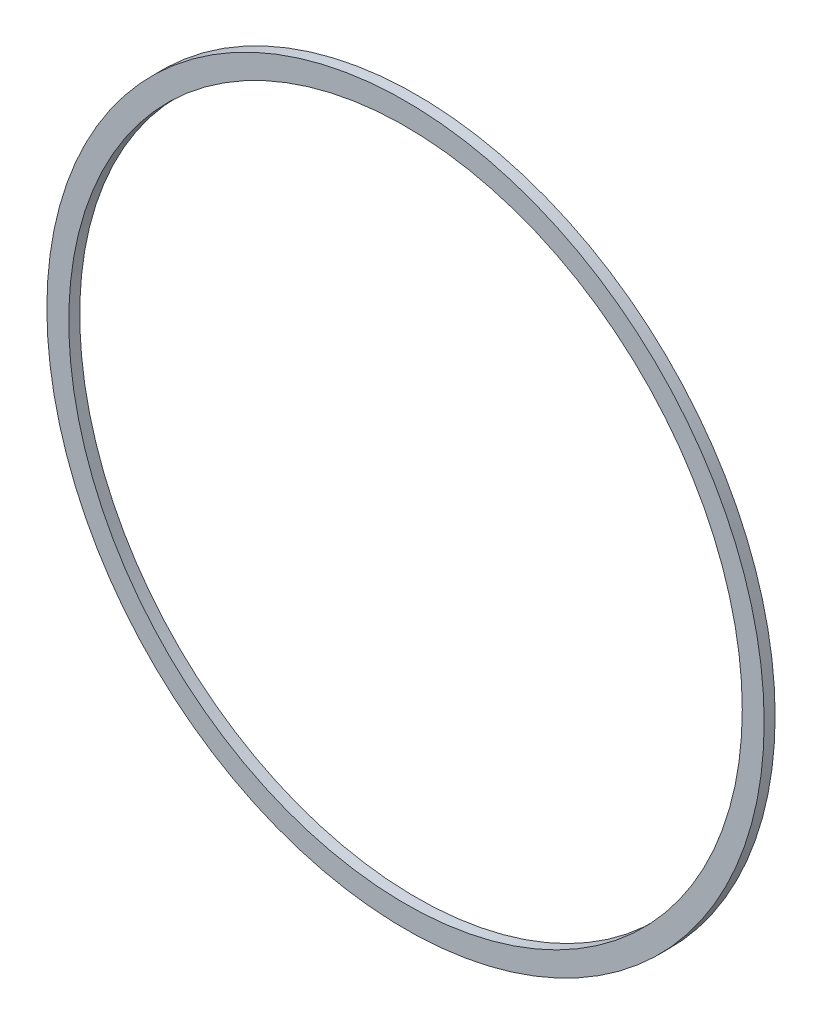
ISO-10303-21;
HEADER;
FILE_DESCRIPTION(('STEP AP214'),'2;1');
FILE_NAME('part.step','',(''),(''),'','','');
FILE_SCHEMA(('AUTOMOTIVE_DESIGN { 1 0 10303 214 1 1 1 1 }'));
ENDSEC;
DATA;
#1=APPLICATION_CONTEXT('core data for automotive mechanical design processes');
#2=APPLICATION_PROTOCOL_DEFINITION('international standard','automotive_design',2000,#1);
#3=PRODUCT_CONTEXT('',#1,'mechanical');
#4=PRODUCT('Part','Part','',(#3));
#5=PRODUCT_RELATED_PRODUCT_CATEGORY('part','',(#4));
#6=PRODUCT_DEFINITION_FORMATION('','',#4);
#7=PRODUCT_DEFINITION_CONTEXT('part definition',#1,'design');
#8=PRODUCT_DEFINITION('design','',#6,#7);
#9=PRODUCT_DEFINITION_SHAPE('','',#8);
#10=(LENGTH_UNIT() NAMED_UNIT(*) SI_UNIT(.MILLI.,.METRE.));
#11=(NAMED_UNIT(*) PLANE_ANGLE_UNIT() SI_UNIT($,.RADIAN.));
#12=(NAMED_UNIT(*) SI_UNIT($,.STERADIAN.) SOLID_ANGLE_UNIT());
#13=UNCERTAINTY_MEASURE_WITH_UNIT(LENGTH_MEASURE(1.E-05),#10,'distance_accuracy_value','');
#14=(GEOMETRIC_REPRESENTATION_CONTEXT(3) GLOBAL_UNCERTAINTY_ASSIGNED_CONTEXT((#13)) GLOBAL_UNIT_ASSIGNED_CONTEXT((#10,
#11,#12)) REPRESENTATION_CONTEXT('',''));
#15=CARTESIAN_POINT('',(0.,0.,0.));
#16=DIRECTION('',(0.,0.,1.));
#17=DIRECTION('',(1.,0.,0.));
#18=AXIS2_PLACEMENT_3D('',#15,#16,#17);
#19=CARTESIAN_POINT('',(0.,0.,1.27));
#20=DIRECTION('',(0.,0.,1.));
#21=DIRECTION('',(1.,0.,0.));
#22=AXIS2_PLACEMENT_3D('',#19,#20,#21);
#23=PLANE('',#22);
#24=CARTESIAN_POINT('',(0.,0.,1.27));
#25=DIRECTION('',(0.,0.,1.));
#26=DIRECTION('',(1.,0.,0.));
#27=AXIS2_PLACEMENT_3D('',#24,#25,#26);
#28=CIRCLE('',#27,41.5925);
#29=CARTESIAN_POINT('',(41.5925,0.,1.27));
#30=VERTEX_POINT('',#29);
#31=EDGE_CURVE('E10',#30,#30,#28,.T.);
#32=ORIENTED_EDGE('',*,*,#31,.T.);
#33=EDGE_LOOP('',(#32));
#34=FACE_BOUND('',#33,.T.);
#35=CARTESIAN_POINT('',(0.,0.,1.27));
#36=DIRECTION('',(0.,0.,1.));
#37=DIRECTION('',(1.,0.,0.));
#38=AXIS2_PLACEMENT_3D('',#35,#36,#37);
#39=CIRCLE('',#38,39.0525);
#40=CARTESIAN_POINT('',(39.0525,0.,1.27));
#41=VERTEX_POINT('',#40);
#42=EDGE_CURVE('E43',#41,#41,#39,.T.);
#43=ORIENTED_EDGE('',*,*,#42,.F.);
#44=EDGE_LOOP('',(#43));
#45=FACE_BOUND('',#44,.T.);
#46=ADVANCED_FACE('F32',(#34,#45),#23,.T.);
#47=CARTESIAN_POINT('',(0.,0.,0.));
#48=DIRECTION('',(0.,0.,1.));
#49=DIRECTION('',(1.,0.,0.));
#50=AXIS2_PLACEMENT_3D('',#47,#48,#49);
#51=PLANE('',#50);
#52=CARTESIAN_POINT('',(0.,0.,0.));
#53=DIRECTION('',(0.,0.,1.));
#54=DIRECTION('',(1.,0.,0.));
#55=AXIS2_PLACEMENT_3D('',#52,#53,#54);
#56=CIRCLE('',#55,41.5925);
#57=CARTESIAN_POINT('',(41.5925,0.,0.));
#58=VERTEX_POINT('',#57);
#59=EDGE_CURVE('E36',#58,#58,#56,.T.);
#60=ORIENTED_EDGE('',*,*,#59,.F.);
#61=EDGE_LOOP('',(#60));
#62=FACE_BOUND('',#61,.T.);
#63=CARTESIAN_POINT('',(0.,0.,0.));
#64=DIRECTION('',(0.,0.,1.));
#65=DIRECTION('',(1.,0.,0.));
#66=AXIS2_PLACEMENT_3D('',#63,#64,#65);
#67=CIRCLE('',#66,39.0525);
#68=CARTESIAN_POINT('',(39.0525,0.,0.));
#69=VERTEX_POINT('',#68);
#70=EDGE_CURVE('E45',#69,#69,#67,.T.);
#71=ORIENTED_EDGE('',*,*,#70,.T.);
#72=EDGE_LOOP('',(#71));
#73=FACE_BOUND('',#72,.T.);
#74=ADVANCED_FACE('F55',(#62,#73),#51,.F.);
#75=CARTESIAN_POINT('',(0.,0.,1.27));
#76=DIRECTION('',(0.,0.,-1.));
#77=DIRECTION('',(-1.,0.,0.));
#78=AXIS2_PLACEMENT_3D('',#75,#76,#77);
#79=CYLINDRICAL_SURFACE('',#78,41.5925);
#80=ORIENTED_EDGE('',*,*,#31,.F.);
#81=EDGE_LOOP('',(#80));
#82=FACE_BOUND('',#81,.T.);
#83=ORIENTED_EDGE('',*,*,#59,.T.);
#84=EDGE_LOOP('',(#83));
#85=FACE_BOUND('',#84,.T.);
#86=ADVANCED_FACE('F34',(#82,#85),#79,.T.);
#87=CARTESIAN_POINT('',(0.,0.,1.27));
#88=DIRECTION('',(0.,0.,-1.));
#89=DIRECTION('',(-1.,0.,0.));
#90=AXIS2_PLACEMENT_3D('',#87,#88,#89);
#91=CYLINDRICAL_SURFACE('',#90,39.0525);
#92=ORIENTED_EDGE('',*,*,#42,.T.);
#93=EDGE_LOOP('',(#92));
#94=FACE_BOUND('',#93,.T.);
#95=ORIENTED_EDGE('',*,*,#70,.F.);
#96=EDGE_LOOP('',(#95));
#97=FACE_BOUND('',#96,.T.);
#98=ADVANCED_FACE('F51',(#94,#97),#91,.F.);
#99=CLOSED_SHELL('',(#46,#74,#86,#98));
#100=MANIFOLD_SOLID_BREP('B2',#99);
#101=ADVANCED_BREP_SHAPE_REPRESENTATION('',(#18,#100),#14);
#102=SHAPE_DEFINITION_REPRESENTATION(#9,#101);
ENDSEC;
END-ISO-10303-21;
